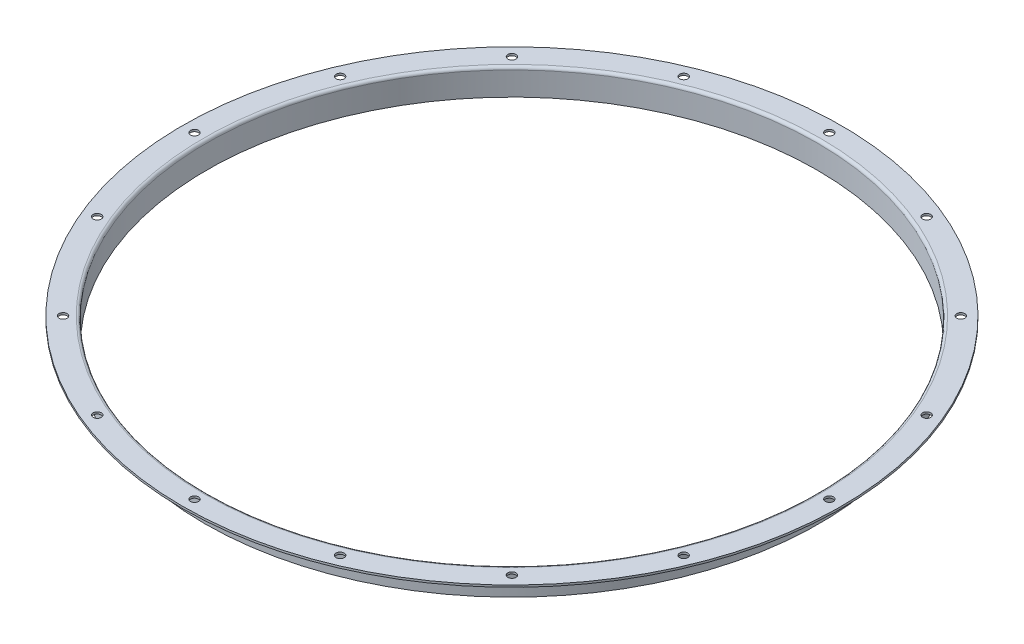
ISO-10303-21;
HEADER;
FILE_DESCRIPTION(('STEP AP214'),'2;1');
FILE_NAME('part.step','',(''),(''),'','','');
FILE_SCHEMA(('AUTOMOTIVE_DESIGN { 1 0 10303 214 1 1 1 1 }'));
ENDSEC;
DATA;
#1=APPLICATION_CONTEXT('core data for automotive mechanical design processes');
#2=APPLICATION_PROTOCOL_DEFINITION('international standard','automotive_design',2000,#1);
#3=PRODUCT_CONTEXT('',#1,'mechanical');
#4=PRODUCT('Part','Part','',(#3));
#5=PRODUCT_RELATED_PRODUCT_CATEGORY('part','',(#4));
#6=PRODUCT_DEFINITION_FORMATION('','',#4);
#7=PRODUCT_DEFINITION_CONTEXT('part definition',#1,'design');
#8=PRODUCT_DEFINITION('design','',#6,#7);
#9=PRODUCT_DEFINITION_SHAPE('','',#8);
#10=(LENGTH_UNIT() NAMED_UNIT(*) SI_UNIT(.MILLI.,.METRE.));
#11=(NAMED_UNIT(*) PLANE_ANGLE_UNIT() SI_UNIT($,.RADIAN.));
#12=(NAMED_UNIT(*) SI_UNIT($,.STERADIAN.) SOLID_ANGLE_UNIT());
#13=UNCERTAINTY_MEASURE_WITH_UNIT(LENGTH_MEASURE(1.E-05),#10,'distance_accuracy_value','');
#14=(GEOMETRIC_REPRESENTATION_CONTEXT(3) GLOBAL_UNCERTAINTY_ASSIGNED_CONTEXT((#13)) GLOBAL_UNIT_ASSIGNED_CONTEXT((#10,
#11,#12)) REPRESENTATION_CONTEXT('',''));
#15=CARTESIAN_POINT('',(0.,0.,0.));
#16=DIRECTION('',(0.,0.,1.));
#17=DIRECTION('',(1.,0.,0.));
#18=AXIS2_PLACEMENT_3D('',#15,#16,#17);
#19=CARTESIAN_POINT('',(0.,-2.5,0.));
#20=DIRECTION('',(0.,1.,0.));
#21=DIRECTION('',(0.,0.,1.));
#22=AXIS2_PLACEMENT_3D('',#19,#20,#21);
#23=PLANE('',#22);
#24=CARTESIAN_POINT('',(-149.820563770931,-2.5,-361.69883697816));
#25=DIRECTION('',(0.,1.,0.));
#26=DIRECTION('',(0.,0.,1.));
#27=AXIS2_PLACEMENT_3D('',#24,#25,#26);
#28=CIRCLE('',#27,5.00000000003186);
#29=CARTESIAN_POINT('',(-149.820563770931,-2.5,-356.698836978128));
#30=VERTEX_POINT('',#29);
#31=EDGE_CURVE('E138',#30,#30,#28,.T.);
#32=ORIENTED_EDGE('',*,*,#31,.T.);
#33=EDGE_LOOP('',(#32));
#34=FACE_BOUND('',#33,.T.);
#35=CARTESIAN_POINT('',(-276.832304834527,-2.5,-276.832304834518));
#36=DIRECTION('',(0.,1.,0.));
#37=DIRECTION('',(0.,0.,1.));
#38=AXIS2_PLACEMENT_3D('',#35,#36,#37);
#39=CIRCLE('',#38,5.00000000003186);
#40=CARTESIAN_POINT('',(-276.832304834527,-2.5,-271.832304834486));
#41=VERTEX_POINT('',#40);
#42=EDGE_CURVE('E304',#41,#41,#39,.T.);
#43=ORIENTED_EDGE('',*,*,#42,.T.);
#44=EDGE_LOOP('',(#43));
#45=FACE_BOUND('',#44,.T.);
#46=CARTESIAN_POINT('',(-361.698836978155,-2.5,-149.820563770912));
#47=DIRECTION('',(0.,1.,0.));
#48=DIRECTION('',(0.,0.,1.));
#49=AXIS2_PLACEMENT_3D('',#46,#47,#48);
#50=CIRCLE('',#49,5.00000000003186);
#51=CARTESIAN_POINT('',(-361.698836978155,-2.5,-144.82056377088));
#52=VERTEX_POINT('',#51);
#53=EDGE_CURVE('E302',#52,#52,#50,.T.);
#54=ORIENTED_EDGE('',*,*,#53,.T.);
#55=EDGE_LOOP('',(#54));
#56=FACE_BOUND('',#55,.T.);
#57=CARTESIAN_POINT('',(-391.499999999978,-2.5,2.22541984840063E-11));
#58=DIRECTION('',(0.,1.,0.));
#59=DIRECTION('',(0.,0.,1.));
#60=AXIS2_PLACEMENT_3D('',#57,#58,#59);
#61=CIRCLE('',#60,5.00000000003186);
#62=CARTESIAN_POINT('',(-391.499999999978,-2.5,5.00000000005411));
#63=VERTEX_POINT('',#62);
#64=EDGE_CURVE('E299',#63,#63,#61,.T.);
#65=ORIENTED_EDGE('',*,*,#64,.T.);
#66=EDGE_LOOP('',(#65));
#67=FACE_BOUND('',#66,.T.);
#68=CARTESIAN_POINT('',(-361.698836978138,-2.5,149.820563770953));
#69=DIRECTION('',(0.,1.,0.));
#70=DIRECTION('',(0.,0.,1.));
#71=AXIS2_PLACEMENT_3D('',#68,#69,#70);
#72=CIRCLE('',#71,5.00000000003186);
#73=CARTESIAN_POINT('',(-361.698836978138,-2.5,154.820563770985));
#74=VERTEX_POINT('',#73);
#75=EDGE_CURVE('E296',#74,#74,#72,.T.);
#76=ORIENTED_EDGE('',*,*,#75,.T.);
#77=EDGE_LOOP('',(#76));
#78=FACE_BOUND('',#77,.T.);
#79=CARTESIAN_POINT('',(-276.832304834495,-2.5,276.832304834549));
#80=DIRECTION('',(0.,1.,0.));
#81=DIRECTION('',(0.,0.,1.));
#82=AXIS2_PLACEMENT_3D('',#79,#80,#81);
#83=CIRCLE('',#82,5.00000000003186);
#84=CARTESIAN_POINT('',(-276.832304834495,-2.5,281.832304834581));
#85=VERTEX_POINT('',#84);
#86=EDGE_CURVE('E293',#85,#85,#83,.T.);
#87=ORIENTED_EDGE('',*,*,#86,.T.);
#88=EDGE_LOOP('',(#87));
#89=FACE_BOUND('',#88,.T.);
#90=CARTESIAN_POINT('',(-149.82056377089,-2.5,361.698836978177));
#91=DIRECTION('',(0.,1.,0.));
#92=DIRECTION('',(0.,0.,1.));
#93=AXIS2_PLACEMENT_3D('',#90,#91,#92);
#94=CIRCLE('',#93,5.00000000003186);
#95=CARTESIAN_POINT('',(-149.82056377089,-2.5,366.698836978209));
#96=VERTEX_POINT('',#95);
#97=EDGE_CURVE('E290',#96,#96,#94,.T.);
#98=ORIENTED_EDGE('',*,*,#97,.T.);
#99=EDGE_LOOP('',(#98));
#100=FACE_BOUND('',#99,.T.);
#101=CARTESIAN_POINT('',(4.45541564282418E-11,-2.5,391.5));
#102=DIRECTION('',(0.,1.,0.));
#103=DIRECTION('',(0.,0.,1.));
#104=AXIS2_PLACEMENT_3D('',#101,#102,#103);
#105=CIRCLE('',#104,5.00000000003188);
#106=CARTESIAN_POINT('',(4.45541564282418E-11,-2.5,396.500000000032));
#107=VERTEX_POINT('',#106);
#108=EDGE_CURVE('E287',#107,#107,#105,.T.);
#109=ORIENTED_EDGE('',*,*,#108,.T.);
#110=EDGE_LOOP('',(#109));
#111=FACE_BOUND('',#110,.T.);
#112=CARTESIAN_POINT('',(149.820563770976,-2.5,361.69883697816));
#113=DIRECTION('',(0.,1.,0.));
#114=DIRECTION('',(0.,0.,1.));
#115=AXIS2_PLACEMENT_3D('',#112,#113,#114);
#116=CIRCLE('',#115,5.00000000003186);
#117=CARTESIAN_POINT('',(149.820563770976,-2.5,366.698836978192));
#118=VERTEX_POINT('',#117);
#119=EDGE_CURVE('E284',#118,#118,#116,.T.);
#120=ORIENTED_EDGE('',*,*,#119,.T.);
#121=EDGE_LOOP('',(#120));
#122=FACE_BOUND('',#121,.T.);
#123=CARTESIAN_POINT('',(276.832304834571,-2.5,276.832304834518));
#124=DIRECTION('',(0.,1.,0.));
#125=DIRECTION('',(0.,0.,1.));
#126=AXIS2_PLACEMENT_3D('',#123,#124,#125);
#127=CIRCLE('',#126,5.00000000003186);
#128=CARTESIAN_POINT('',(276.832304834571,-2.5,281.83230483455));
#129=VERTEX_POINT('',#128);
#130=EDGE_CURVE('E281',#129,#129,#127,.T.);
#131=ORIENTED_EDGE('',*,*,#130,.T.);
#132=EDGE_LOOP('',(#131));
#133=FACE_BOUND('',#132,.T.);
#134=CARTESIAN_POINT('',(361.6988369782,-2.5,149.820563770912));
#135=DIRECTION('',(0.,1.,0.));
#136=DIRECTION('',(0.,0.,1.));
#137=AXIS2_PLACEMENT_3D('',#134,#135,#136);
#138=CIRCLE('',#137,5.00000000003186);
#139=CARTESIAN_POINT('',(361.6988369782,-2.5,154.820563770944));
#140=VERTEX_POINT('',#139);
#141=EDGE_CURVE('E278',#140,#140,#138,.T.);
#142=ORIENTED_EDGE('',*,*,#141,.T.);
#143=EDGE_LOOP('',(#142));
#144=FACE_BOUND('',#143,.T.);
#145=CARTESIAN_POINT('',(391.500000000022,-2.5,-2.22062535618197E-11));
#146=DIRECTION('',(0.,1.,0.));
#147=DIRECTION('',(0.,0.,1.));
#148=AXIS2_PLACEMENT_3D('',#145,#146,#147);
#149=CIRCLE('',#148,5.00000000003186);
#150=CARTESIAN_POINT('',(391.500000000022,-2.5,5.00000000000965));
#151=VERTEX_POINT('',#150);
#152=EDGE_CURVE('E275',#151,#151,#149,.T.);
#153=ORIENTED_EDGE('',*,*,#152,.T.);
#154=EDGE_LOOP('',(#153));
#155=FACE_BOUND('',#154,.T.);
#156=CARTESIAN_POINT('',(361.698836978183,-2.5,-149.820563770953));
#157=DIRECTION('',(0.,1.,0.));
#158=DIRECTION('',(0.,0.,1.));
#159=AXIS2_PLACEMENT_3D('',#156,#157,#158);
#160=CIRCLE('',#159,5.00000000003186);
#161=CARTESIAN_POINT('',(361.698836978183,-2.5,-144.820563770921));
#162=VERTEX_POINT('',#161);
#163=EDGE_CURVE('E266',#162,#162,#160,.T.);
#164=ORIENTED_EDGE('',*,*,#163,.T.);
#165=EDGE_LOOP('',(#164));
#166=FACE_BOUND('',#165,.T.);
#167=CARTESIAN_POINT('',(1.4164930460234E-13,-2.5,-391.5));
#168=DIRECTION('',(0.,1.,0.));
#169=DIRECTION('',(0.,0.,1.));
#170=AXIS2_PLACEMENT_3D('',#167,#168,#169);
#171=CIRCLE('',#170,5.00000000003188);
#172=CARTESIAN_POINT('',(1.4164930460234E-13,-2.5,-386.499999999968));
#173=VERTEX_POINT('',#172);
#174=EDGE_CURVE('E262',#173,#173,#171,.T.);
#175=ORIENTED_EDGE('',*,*,#174,.T.);
#176=EDGE_LOOP('',(#175));
#177=FACE_BOUND('',#176,.T.);
#178=CARTESIAN_POINT('',(276.83230483454,-2.5,-276.832304834549));
#179=DIRECTION('',(0.,1.,0.));
#180=DIRECTION('',(0.,0.,1.));
#181=AXIS2_PLACEMENT_3D('',#178,#179,#180);
#182=CIRCLE('',#181,5.00000000003186);
#183=CARTESIAN_POINT('',(276.83230483454,-2.5,-271.832304834517));
#184=VERTEX_POINT('',#183);
#185=EDGE_CURVE('E260',#184,#184,#182,.T.);
#186=ORIENTED_EDGE('',*,*,#185,.T.);
#187=EDGE_LOOP('',(#186));
#188=FACE_BOUND('',#187,.T.);
#189=CARTESIAN_POINT('',(149.820563770934,-2.5,-361.698836978177));
#190=DIRECTION('',(0.,1.,0.));
#191=DIRECTION('',(0.,0.,1.));
#192=AXIS2_PLACEMENT_3D('',#189,#190,#191);
#193=CIRCLE('',#192,5.00000000003186);
#194=CARTESIAN_POINT('',(149.820563770934,-2.5,-356.698836978145));
#195=VERTEX_POINT('',#194);
#196=EDGE_CURVE('E263',#195,#195,#193,.T.);
#197=ORIENTED_EDGE('',*,*,#196,.T.);
#198=EDGE_LOOP('',(#197));
#199=FACE_BOUND('',#198,.T.);
#200=CARTESIAN_POINT('',(0.,-2.5,0.));
#201=DIRECTION('',(0.,1.,0.));
#202=DIRECTION('',(0.,0.,1.));
#203=AXIS2_PLACEMENT_3D('',#200,#201,#202);
#204=CIRCLE('',#203,406.5);
#205=CARTESIAN_POINT('',(0.,-2.5,406.5));
#206=VERTEX_POINT('',#205);
#207=EDGE_CURVE('E95',#206,#206,#204,.T.);
#208=ORIENTED_EDGE('',*,*,#207,.F.);
#209=EDGE_LOOP('',(#208));
#210=FACE_BOUND('',#209,.T.);
#211=CARTESIAN_POINT('',(0.,-2.5,0.));
#212=DIRECTION('',(0.,1.,0.));
#213=DIRECTION('',(0.,0.,1.));
#214=AXIS2_PLACEMENT_3D('',#211,#212,#213);
#215=CIRCLE('',#214,380.);
#216=CARTESIAN_POINT('',(0.,-2.5,380.));
#217=VERTEX_POINT('',#216);
#218=EDGE_CURVE('E12',#217,#217,#215,.F.);
#219=ORIENTED_EDGE('',*,*,#218,.F.);
#220=EDGE_LOOP('',(#219));
#221=FACE_BOUND('',#220,.T.);
#222=ADVANCED_FACE('F87',(#34,#45,#56,#67,#78,#89,#100,#111,#122,#133,#144,#155,#166,#177,#188,
#199,#210,#221),#23,.F.);
#223=CARTESIAN_POINT('',(0.,0.,0.));
#224=DIRECTION('',(0.,1.,0.));
#225=DIRECTION('',(0.,0.,1.));
#226=AXIS2_PLACEMENT_3D('',#223,#224,#225);
#227=PLANE('',#226);
#228=CARTESIAN_POINT('',(-149.820563770931,0.,-361.69883697816));
#229=DIRECTION('',(0.,1.,0.));
#230=DIRECTION('',(0.,0.,1.));
#231=AXIS2_PLACEMENT_3D('',#228,#229,#230);
#232=CIRCLE('',#231,5.00000000003186);
#233=CARTESIAN_POINT('',(-149.820563770931,0.,-356.698836978128));
#234=VERTEX_POINT('',#233);
#235=EDGE_CURVE('E353',#234,#234,#232,.T.);
#236=ORIENTED_EDGE('',*,*,#235,.F.);
#237=EDGE_LOOP('',(#236));
#238=FACE_BOUND('',#237,.T.);
#239=CARTESIAN_POINT('',(-276.832304834527,0.,-276.832304834518));
#240=DIRECTION('',(0.,1.,0.));
#241=DIRECTION('',(0.,0.,1.));
#242=AXIS2_PLACEMENT_3D('',#239,#240,#241);
#243=CIRCLE('',#242,5.00000000003186);
#244=CARTESIAN_POINT('',(-276.832304834527,0.,-271.832304834486));
#245=VERTEX_POINT('',#244);
#246=EDGE_CURVE('E356',#245,#245,#243,.T.);
#247=ORIENTED_EDGE('',*,*,#246,.F.);
#248=EDGE_LOOP('',(#247));
#249=FACE_BOUND('',#248,.T.);
#250=CARTESIAN_POINT('',(-361.698836978155,0.,-149.820563770912));
#251=DIRECTION('',(0.,1.,0.));
#252=DIRECTION('',(0.,0.,1.));
#253=AXIS2_PLACEMENT_3D('',#250,#251,#252);
#254=CIRCLE('',#253,5.00000000003186);
#255=CARTESIAN_POINT('',(-361.698836978155,0.,-144.82056377088));
#256=VERTEX_POINT('',#255);
#257=EDGE_CURVE('E359',#256,#256,#254,.T.);
#258=ORIENTED_EDGE('',*,*,#257,.F.);
#259=EDGE_LOOP('',(#258));
#260=FACE_BOUND('',#259,.T.);
#261=CARTESIAN_POINT('',(-391.499999999978,0.,2.22541984840063E-11));
#262=DIRECTION('',(0.,1.,0.));
#263=DIRECTION('',(0.,0.,1.));
#264=AXIS2_PLACEMENT_3D('',#261,#262,#263);
#265=CIRCLE('',#264,5.00000000003186);
#266=CARTESIAN_POINT('',(-391.499999999978,0.,5.00000000005411));
#267=VERTEX_POINT('',#266);
#268=EDGE_CURVE('E362',#267,#267,#265,.T.);
#269=ORIENTED_EDGE('',*,*,#268,.F.);
#270=EDGE_LOOP('',(#269));
#271=FACE_BOUND('',#270,.T.);
#272=CARTESIAN_POINT('',(-361.698836978138,0.,149.820563770953));
#273=DIRECTION('',(0.,1.,0.));
#274=DIRECTION('',(0.,0.,1.));
#275=AXIS2_PLACEMENT_3D('',#272,#273,#274);
#276=CIRCLE('',#275,5.00000000003186);
#277=CARTESIAN_POINT('',(-361.698836978138,0.,154.820563770985));
#278=VERTEX_POINT('',#277);
#279=EDGE_CURVE('E365',#278,#278,#276,.T.);
#280=ORIENTED_EDGE('',*,*,#279,.F.);
#281=EDGE_LOOP('',(#280));
#282=FACE_BOUND('',#281,.T.);
#283=CARTESIAN_POINT('',(-276.832304834495,0.,276.832304834549));
#284=DIRECTION('',(0.,1.,0.));
#285=DIRECTION('',(0.,0.,1.));
#286=AXIS2_PLACEMENT_3D('',#283,#284,#285);
#287=CIRCLE('',#286,5.00000000003186);
#288=CARTESIAN_POINT('',(-276.832304834495,0.,281.832304834581));
#289=VERTEX_POINT('',#288);
#290=EDGE_CURVE('E368',#289,#289,#287,.T.);
#291=ORIENTED_EDGE('',*,*,#290,.F.);
#292=EDGE_LOOP('',(#291));
#293=FACE_BOUND('',#292,.T.);
#294=CARTESIAN_POINT('',(-149.82056377089,0.,361.698836978177));
#295=DIRECTION('',(0.,1.,0.));
#296=DIRECTION('',(0.,0.,1.));
#297=AXIS2_PLACEMENT_3D('',#294,#295,#296);
#298=CIRCLE('',#297,5.00000000003186);
#299=CARTESIAN_POINT('',(-149.82056377089,0.,366.698836978209));
#300=VERTEX_POINT('',#299);
#301=EDGE_CURVE('E371',#300,#300,#298,.T.);
#302=ORIENTED_EDGE('',*,*,#301,.F.);
#303=EDGE_LOOP('',(#302));
#304=FACE_BOUND('',#303,.T.);
#305=CARTESIAN_POINT('',(4.45541564282418E-11,0.,391.5));
#306=DIRECTION('',(0.,1.,0.));
#307=DIRECTION('',(0.,0.,1.));
#308=AXIS2_PLACEMENT_3D('',#305,#306,#307);
#309=CIRCLE('',#308,5.00000000003188);
#310=CARTESIAN_POINT('',(4.45541564282418E-11,0.,396.500000000032));
#311=VERTEX_POINT('',#310);
#312=EDGE_CURVE('E374',#311,#311,#309,.T.);
#313=ORIENTED_EDGE('',*,*,#312,.F.);
#314=EDGE_LOOP('',(#313));
#315=FACE_BOUND('',#314,.T.);
#316=CARTESIAN_POINT('',(149.820563770976,0.,361.69883697816));
#317=DIRECTION('',(0.,1.,0.));
#318=DIRECTION('',(0.,0.,1.));
#319=AXIS2_PLACEMENT_3D('',#316,#317,#318);
#320=CIRCLE('',#319,5.00000000003186);
#321=CARTESIAN_POINT('',(149.820563770976,0.,366.698836978192));
#322=VERTEX_POINT('',#321);
#323=EDGE_CURVE('E377',#322,#322,#320,.T.);
#324=ORIENTED_EDGE('',*,*,#323,.F.);
#325=EDGE_LOOP('',(#324));
#326=FACE_BOUND('',#325,.T.);
#327=CARTESIAN_POINT('',(276.832304834571,0.,276.832304834518));
#328=DIRECTION('',(0.,1.,0.));
#329=DIRECTION('',(0.,0.,1.));
#330=AXIS2_PLACEMENT_3D('',#327,#328,#329);
#331=CIRCLE('',#330,5.00000000003186);
#332=CARTESIAN_POINT('',(276.832304834571,0.,281.83230483455));
#333=VERTEX_POINT('',#332);
#334=EDGE_CURVE('E380',#333,#333,#331,.T.);
#335=ORIENTED_EDGE('',*,*,#334,.F.);
#336=EDGE_LOOP('',(#335));
#337=FACE_BOUND('',#336,.T.);
#338=CARTESIAN_POINT('',(361.6988369782,0.,149.820563770912));
#339=DIRECTION('',(0.,1.,0.));
#340=DIRECTION('',(0.,0.,1.));
#341=AXIS2_PLACEMENT_3D('',#338,#339,#340);
#342=CIRCLE('',#341,5.00000000003186);
#343=CARTESIAN_POINT('',(361.6988369782,0.,154.820563770944));
#344=VERTEX_POINT('',#343);
#345=EDGE_CURVE('E383',#344,#344,#342,.T.);
#346=ORIENTED_EDGE('',*,*,#345,.F.);
#347=EDGE_LOOP('',(#346));
#348=FACE_BOUND('',#347,.T.);
#349=CARTESIAN_POINT('',(391.500000000022,0.,-2.22062535618197E-11));
#350=DIRECTION('',(0.,1.,0.));
#351=DIRECTION('',(0.,0.,1.));
#352=AXIS2_PLACEMENT_3D('',#349,#350,#351);
#353=CIRCLE('',#352,5.00000000003186);
#354=CARTESIAN_POINT('',(391.500000000022,0.,5.00000000000965));
#355=VERTEX_POINT('',#354);
#356=EDGE_CURVE('E386',#355,#355,#353,.T.);
#357=ORIENTED_EDGE('',*,*,#356,.F.);
#358=EDGE_LOOP('',(#357));
#359=FACE_BOUND('',#358,.T.);
#360=CARTESIAN_POINT('',(361.698836978183,0.,-149.820563770953));
#361=DIRECTION('',(0.,1.,0.));
#362=DIRECTION('',(0.,0.,1.));
#363=AXIS2_PLACEMENT_3D('',#360,#361,#362);
#364=CIRCLE('',#363,5.00000000003186);
#365=CARTESIAN_POINT('',(361.698836978183,0.,-144.820563770921));
#366=VERTEX_POINT('',#365);
#367=EDGE_CURVE('E389',#366,#366,#364,.T.);
#368=ORIENTED_EDGE('',*,*,#367,.F.);
#369=EDGE_LOOP('',(#368));
#370=FACE_BOUND('',#369,.T.);
#371=CARTESIAN_POINT('',(1.4164930460234E-13,0.,-391.5));
#372=DIRECTION('',(0.,1.,0.));
#373=DIRECTION('',(0.,0.,1.));
#374=AXIS2_PLACEMENT_3D('',#371,#372,#373);
#375=CIRCLE('',#374,5.00000000003188);
#376=CARTESIAN_POINT('',(1.4164930460234E-13,0.,-386.499999999968));
#377=VERTEX_POINT('',#376);
#378=EDGE_CURVE('E392',#377,#377,#375,.T.);
#379=ORIENTED_EDGE('',*,*,#378,.F.);
#380=EDGE_LOOP('',(#379));
#381=FACE_BOUND('',#380,.T.);
#382=CARTESIAN_POINT('',(276.83230483454,0.,-276.832304834549));
#383=DIRECTION('',(0.,1.,0.));
#384=DIRECTION('',(0.,0.,1.));
#385=AXIS2_PLACEMENT_3D('',#382,#383,#384);
#386=CIRCLE('',#385,5.00000000003186);
#387=CARTESIAN_POINT('',(276.83230483454,0.,-271.832304834517));
#388=VERTEX_POINT('',#387);
#389=EDGE_CURVE('E257',#388,#388,#386,.T.);
#390=ORIENTED_EDGE('',*,*,#389,.F.);
#391=EDGE_LOOP('',(#390));
#392=FACE_BOUND('',#391,.T.);
#393=CARTESIAN_POINT('',(149.820563770934,0.,-361.698836978177));
#394=DIRECTION('',(0.,1.,0.));
#395=DIRECTION('',(0.,0.,1.));
#396=AXIS2_PLACEMENT_3D('',#393,#394,#395);
#397=CIRCLE('',#396,5.00000000003186);
#398=CARTESIAN_POINT('',(149.820563770934,0.,-356.698836978145));
#399=VERTEX_POINT('',#398);
#400=EDGE_CURVE('E269',#399,#399,#397,.T.);
#401=ORIENTED_EDGE('',*,*,#400,.F.);
#402=EDGE_LOOP('',(#401));
#403=FACE_BOUND('',#402,.T.);
#404=CARTESIAN_POINT('',(0.,0.,0.));
#405=DIRECTION('',(0.,1.,0.));
#406=DIRECTION('',(0.,0.,1.));
#407=AXIS2_PLACEMENT_3D('',#404,#405,#406);
#408=CIRCLE('',#407,406.5);
#409=CARTESIAN_POINT('',(0.,0.,406.5));
#410=VERTEX_POINT('',#409);
#411=EDGE_CURVE('E151',#410,#410,#408,.T.);
#412=ORIENTED_EDGE('',*,*,#411,.T.);
#413=EDGE_LOOP('',(#412));
#414=FACE_BOUND('',#413,.T.);
#415=CARTESIAN_POINT('',(0.,0.,0.));
#416=DIRECTION('',(0.,1.,0.));
#417=DIRECTION('',(0.,0.,1.));
#418=AXIS2_PLACEMENT_3D('',#415,#416,#417);
#419=CIRCLE('',#418,380.);
#420=CARTESIAN_POINT('',(0.,0.,380.));
#421=VERTEX_POINT('',#420);
#422=EDGE_CURVE('E102',#421,#421,#419,.T.);
#423=ORIENTED_EDGE('',*,*,#422,.F.);
#424=EDGE_LOOP('',(#423));
#425=FACE_BOUND('',#424,.T.);
#426=ADVANCED_FACE('F156',(#238,#249,#260,#271,#282,#293,#304,#315,#326,#337,#348,#359,#370,
#381,#392,#403,#414,#425),#227,.T.);
#427=CARTESIAN_POINT('',(0.,-2.5,0.));
#428=DIRECTION('',(0.,1.,0.));
#429=DIRECTION('',(0.,0.,1.));
#430=AXIS2_PLACEMENT_3D('',#427,#428,#429);
#431=CYLINDRICAL_SURFACE('',#430,406.5);
#432=ORIENTED_EDGE('',*,*,#207,.T.);
#433=EDGE_LOOP('',(#432));
#434=FACE_BOUND('',#433,.T.);
#435=ORIENTED_EDGE('',*,*,#411,.F.);
#436=EDGE_LOOP('',(#435));
#437=FACE_BOUND('',#436,.T.);
#438=ADVANCED_FACE('F89',(#434,#437),#431,.T.);
#439=CARTESIAN_POINT('',(0.,-32.5,0.));
#440=DIRECTION('',(0.,-1.,0.));
#441=DIRECTION('',(0.,0.,-1.));
#442=AXIS2_PLACEMENT_3D('',#439,#440,#441);
#443=PLANE('',#442);
#444=CARTESIAN_POINT('',(0.,-32.5,0.));
#445=DIRECTION('',(0.,1.,0.));
#446=DIRECTION('',(0.,0.,1.));
#447=AXIS2_PLACEMENT_3D('',#444,#445,#446);
#448=CIRCLE('',#447,376.5);
#449=CARTESIAN_POINT('',(0.,-32.5,376.5));
#450=VERTEX_POINT('',#449);
#451=EDGE_CURVE('E130',#450,#450,#448,.T.);
#452=ORIENTED_EDGE('',*,*,#451,.T.);
#453=EDGE_LOOP('',(#452));
#454=FACE_BOUND('',#453,.T.);
#455=CARTESIAN_POINT('',(0.,-32.5,0.));
#456=DIRECTION('',(0.,1.,0.));
#457=DIRECTION('',(0.,0.,1.));
#458=AXIS2_PLACEMENT_3D('',#455,#456,#457);
#459=CIRCLE('',#458,379.);
#460=CARTESIAN_POINT('',(0.,-32.5,379.));
#461=VERTEX_POINT('',#460);
#462=EDGE_CURVE('E140',#461,#461,#459,.T.);
#463=ORIENTED_EDGE('',*,*,#462,.F.);
#464=EDGE_LOOP('',(#463));
#465=FACE_BOUND('',#464,.T.);
#466=ADVANCED_FACE('F160',(#454,#465),#443,.T.);
#467=CARTESIAN_POINT('',(0.,-2.5,0.));
#468=DIRECTION('',(0.,1.,0.));
#469=DIRECTION('',(0.,0.,1.));
#470=AXIS2_PLACEMENT_3D('',#467,#468,#469);
#471=CYLINDRICAL_SURFACE('',#470,379.);
#472=DIRECTION('',(0.,-1.,0.));
#473=VECTOR('',#472,1.);
#474=CARTESIAN_POINT('',(0.,-2.5,379.));
#475=LINE('',#474,#473);
#476=CARTESIAN_POINT('',(0.,-3.5,379.));
#477=VERTEX_POINT('',#476);
#478=EDGE_CURVE('E129',#477,#461,#475,.T.);
#479=ORIENTED_EDGE('',*,*,#478,.F.);
#480=CARTESIAN_POINT('',(0.,-3.5,0.));
#481=DIRECTION('',(0.,1.,0.));
#482=DIRECTION('',(0.,0.,1.));
#483=AXIS2_PLACEMENT_3D('',#480,#481,#482);
#484=CIRCLE('',#483,379.);
#485=EDGE_CURVE('E128',#477,#477,#484,.T.);
#486=ORIENTED_EDGE('',*,*,#485,.F.);
#487=ORIENTED_EDGE('',*,*,#478,.T.);
#488=ORIENTED_EDGE('',*,*,#462,.T.);
#489=EDGE_LOOP('',(#479,#486,#487,#488));
#490=FACE_BOUND('',#489,.T.);
#491=ADVANCED_FACE('F166',(#490),#471,.T.);
#492=CARTESIAN_POINT('',(0.,-3.5,0.));
#493=DIRECTION('',(0.,1.,0.));
#494=DIRECTION('',(0.,0.,1.));
#495=AXIS2_PLACEMENT_3D('',#492,#493,#494);
#496=TOROIDAL_SURFACE('',#495,380.,1.);
#497=CARTESIAN_POINT('',(0.,-3.5,380.));
#498=DIRECTION('',(1.,0.,0.));
#499=DIRECTION('',(0.,1.,0.));
#500=AXIS2_PLACEMENT_3D('',#497,#498,#499);
#501=CIRCLE('',#500,1.);
#502=EDGE_CURVE('E126',#217,#477,#501,.F.);
#503=ORIENTED_EDGE('',*,*,#502,.F.);
#504=ORIENTED_EDGE('',*,*,#218,.T.);
#505=ORIENTED_EDGE('',*,*,#502,.T.);
#506=ORIENTED_EDGE('',*,*,#485,.T.);
#507=EDGE_LOOP('',(#503,#504,#505,#506));
#508=FACE_BOUND('',#507,.T.);
#509=ADVANCED_FACE('F125',(#508),#496,.F.);
#510=CARTESIAN_POINT('',(0.,-2.5,0.));
#511=DIRECTION('',(0.,1.,0.));
#512=DIRECTION('',(0.,0.,1.));
#513=AXIS2_PLACEMENT_3D('',#510,#511,#512);
#514=CYLINDRICAL_SURFACE('',#513,376.5);
#515=DIRECTION('',(0.,1.,0.));
#516=VECTOR('',#515,1.);
#517=CARTESIAN_POINT('',(0.,-2.5,376.5));
#518=LINE('',#517,#516);
#519=CARTESIAN_POINT('',(0.,-3.50000000000001,376.5));
#520=VERTEX_POINT('',#519);
#521=EDGE_CURVE('E143',#520,#450,#518,.F.);
#522=ORIENTED_EDGE('',*,*,#521,.T.);
#523=ORIENTED_EDGE('',*,*,#451,.F.);
#524=ORIENTED_EDGE('',*,*,#521,.F.);
#525=CARTESIAN_POINT('',(0.,-3.50000000000001,0.));
#526=DIRECTION('',(0.,1.,0.));
#527=DIRECTION('',(0.,0.,1.));
#528=AXIS2_PLACEMENT_3D('',#525,#526,#527);
#529=CIRCLE('',#528,376.5);
#530=EDGE_CURVE('E134',#520,#520,#529,.T.);
#531=ORIENTED_EDGE('',*,*,#530,.T.);
#532=EDGE_LOOP('',(#522,#523,#524,#531));
#533=FACE_BOUND('',#532,.T.);
#534=ADVANCED_FACE('F181',(#533),#514,.F.);
#535=CARTESIAN_POINT('',(0.,-3.5,0.));
#536=DIRECTION('',(0.,1.,0.));
#537=DIRECTION('',(0.,0.,1.));
#538=AXIS2_PLACEMENT_3D('',#535,#536,#537);
#539=TOROIDAL_SURFACE('',#538,380.,3.5);
#540=CARTESIAN_POINT('',(0.,-3.5,380.));
#541=DIRECTION('',(-1.,0.,0.));
#542=DIRECTION('',(0.,0.,1.));
#543=AXIS2_PLACEMENT_3D('',#540,#541,#542);
#544=CIRCLE('',#543,3.5);
#545=EDGE_CURVE('E145',#421,#520,#544,.T.);
#546=ORIENTED_EDGE('',*,*,#545,.T.);
#547=ORIENTED_EDGE('',*,*,#530,.F.);
#548=ORIENTED_EDGE('',*,*,#545,.F.);
#549=ORIENTED_EDGE('',*,*,#422,.T.);
#550=EDGE_LOOP('',(#546,#547,#548,#549));
#551=FACE_BOUND('',#550,.T.);
#552=ADVANCED_FACE('F177',(#551),#539,.T.);
#553=CARTESIAN_POINT('',(149.820563770934,-10.,-361.698836978177));
#554=DIRECTION('',(0.,1.,0.));
#555=DIRECTION('',(0.,0.,1.));
#556=AXIS2_PLACEMENT_3D('',#553,#554,#555);
#557=CYLINDRICAL_SURFACE('',#556,5.00000000003186);
#558=ORIENTED_EDGE('',*,*,#400,.T.);
#559=EDGE_LOOP('',(#558));
#560=FACE_BOUND('',#559,.T.);
#561=ORIENTED_EDGE('',*,*,#196,.F.);
#562=EDGE_LOOP('',(#561));
#563=FACE_BOUND('',#562,.T.);
#564=ADVANCED_FACE('F180',(#560,#563),#557,.F.);
#565=CARTESIAN_POINT('',(276.83230483454,-10.,-276.832304834549));
#566=DIRECTION('',(0.,1.,0.));
#567=DIRECTION('',(0.,0.,1.));
#568=AXIS2_PLACEMENT_3D('',#565,#566,#567);
#569=CYLINDRICAL_SURFACE('',#568,5.00000000003186);
#570=ORIENTED_EDGE('',*,*,#389,.T.);
#571=EDGE_LOOP('',(#570));
#572=FACE_BOUND('',#571,.T.);
#573=ORIENTED_EDGE('',*,*,#185,.F.);
#574=EDGE_LOOP('',(#573));
#575=FACE_BOUND('',#574,.T.);
#576=ADVANCED_FACE('F192',(#572,#575),#569,.F.);
#577=CARTESIAN_POINT('',(1.4164930460234E-13,-10.,-391.5));
#578=DIRECTION('',(0.,1.,0.));
#579=DIRECTION('',(0.,0.,1.));
#580=AXIS2_PLACEMENT_3D('',#577,#578,#579);
#581=CYLINDRICAL_SURFACE('',#580,5.00000000003188);
#582=ORIENTED_EDGE('',*,*,#378,.T.);
#583=EDGE_LOOP('',(#582));
#584=FACE_BOUND('',#583,.T.);
#585=ORIENTED_EDGE('',*,*,#174,.F.);
#586=EDGE_LOOP('',(#585));
#587=FACE_BOUND('',#586,.T.);
#588=ADVANCED_FACE('F245',(#584,#587),#581,.F.);
#589=CARTESIAN_POINT('',(361.698836978183,-10.,-149.820563770953));
#590=DIRECTION('',(0.,1.,0.));
#591=DIRECTION('',(0.,0.,1.));
#592=AXIS2_PLACEMENT_3D('',#589,#590,#591);
#593=CYLINDRICAL_SURFACE('',#592,5.00000000003186);
#594=ORIENTED_EDGE('',*,*,#367,.T.);
#595=EDGE_LOOP('',(#594));
#596=FACE_BOUND('',#595,.T.);
#597=ORIENTED_EDGE('',*,*,#163,.F.);
#598=EDGE_LOOP('',(#597));
#599=FACE_BOUND('',#598,.T.);
#600=ADVANCED_FACE('F241',(#596,#599),#593,.F.);
#601=CARTESIAN_POINT('',(391.500000000022,-10.,-2.22062535618197E-11));
#602=DIRECTION('',(0.,1.,0.));
#603=DIRECTION('',(0.,0.,1.));
#604=AXIS2_PLACEMENT_3D('',#601,#602,#603);
#605=CYLINDRICAL_SURFACE('',#604,5.00000000003186);
#606=ORIENTED_EDGE('',*,*,#356,.T.);
#607=EDGE_LOOP('',(#606));
#608=FACE_BOUND('',#607,.T.);
#609=ORIENTED_EDGE('',*,*,#152,.F.);
#610=EDGE_LOOP('',(#609));
#611=FACE_BOUND('',#610,.T.);
#612=ADVANCED_FACE('F237',(#608,#611),#605,.F.);
#613=CARTESIAN_POINT('',(361.6988369782,-10.,149.820563770912));
#614=DIRECTION('',(0.,1.,0.));
#615=DIRECTION('',(0.,0.,1.));
#616=AXIS2_PLACEMENT_3D('',#613,#614,#615);
#617=CYLINDRICAL_SURFACE('',#616,5.00000000003186);
#618=ORIENTED_EDGE('',*,*,#345,.T.);
#619=EDGE_LOOP('',(#618));
#620=FACE_BOUND('',#619,.T.);
#621=ORIENTED_EDGE('',*,*,#141,.F.);
#622=EDGE_LOOP('',(#621));
#623=FACE_BOUND('',#622,.T.);
#624=ADVANCED_FACE('F233',(#620,#623),#617,.F.);
#625=CARTESIAN_POINT('',(276.832304834571,-10.,276.832304834518));
#626=DIRECTION('',(0.,1.,0.));
#627=DIRECTION('',(0.,0.,1.));
#628=AXIS2_PLACEMENT_3D('',#625,#626,#627);
#629=CYLINDRICAL_SURFACE('',#628,5.00000000003186);
#630=ORIENTED_EDGE('',*,*,#334,.T.);
#631=EDGE_LOOP('',(#630));
#632=FACE_BOUND('',#631,.T.);
#633=ORIENTED_EDGE('',*,*,#130,.F.);
#634=EDGE_LOOP('',(#633));
#635=FACE_BOUND('',#634,.T.);
#636=ADVANCED_FACE('F229',(#632,#635),#629,.F.);
#637=CARTESIAN_POINT('',(149.820563770976,-10.,361.69883697816));
#638=DIRECTION('',(0.,1.,0.));
#639=DIRECTION('',(0.,0.,1.));
#640=AXIS2_PLACEMENT_3D('',#637,#638,#639);
#641=CYLINDRICAL_SURFACE('',#640,5.00000000003186);
#642=ORIENTED_EDGE('',*,*,#323,.T.);
#643=EDGE_LOOP('',(#642));
#644=FACE_BOUND('',#643,.T.);
#645=ORIENTED_EDGE('',*,*,#119,.F.);
#646=EDGE_LOOP('',(#645));
#647=FACE_BOUND('',#646,.T.);
#648=ADVANCED_FACE('F225',(#644,#647),#641,.F.);
#649=CARTESIAN_POINT('',(4.45541564282418E-11,-10.,391.5));
#650=DIRECTION('',(0.,1.,0.));
#651=DIRECTION('',(0.,0.,1.));
#652=AXIS2_PLACEMENT_3D('',#649,#650,#651);
#653=CYLINDRICAL_SURFACE('',#652,5.00000000003188);
#654=ORIENTED_EDGE('',*,*,#312,.T.);
#655=EDGE_LOOP('',(#654));
#656=FACE_BOUND('',#655,.T.);
#657=ORIENTED_EDGE('',*,*,#108,.F.);
#658=EDGE_LOOP('',(#657));
#659=FACE_BOUND('',#658,.T.);
#660=ADVANCED_FACE('F221',(#656,#659),#653,.F.);
#661=CARTESIAN_POINT('',(-149.82056377089,-10.,361.698836978177));
#662=DIRECTION('',(0.,1.,0.));
#663=DIRECTION('',(0.,0.,1.));
#664=AXIS2_PLACEMENT_3D('',#661,#662,#663);
#665=CYLINDRICAL_SURFACE('',#664,5.00000000003186);
#666=ORIENTED_EDGE('',*,*,#301,.T.);
#667=EDGE_LOOP('',(#666));
#668=FACE_BOUND('',#667,.T.);
#669=ORIENTED_EDGE('',*,*,#97,.F.);
#670=EDGE_LOOP('',(#669));
#671=FACE_BOUND('',#670,.T.);
#672=ADVANCED_FACE('F217',(#668,#671),#665,.F.);
#673=CARTESIAN_POINT('',(-276.832304834495,-10.,276.832304834549));
#674=DIRECTION('',(0.,1.,0.));
#675=DIRECTION('',(0.,0.,1.));
#676=AXIS2_PLACEMENT_3D('',#673,#674,#675);
#677=CYLINDRICAL_SURFACE('',#676,5.00000000003186);
#678=ORIENTED_EDGE('',*,*,#290,.T.);
#679=EDGE_LOOP('',(#678));
#680=FACE_BOUND('',#679,.T.);
#681=ORIENTED_EDGE('',*,*,#86,.F.);
#682=EDGE_LOOP('',(#681));
#683=FACE_BOUND('',#682,.T.);
#684=ADVANCED_FACE('F213',(#680,#683),#677,.F.);
#685=CARTESIAN_POINT('',(-361.698836978138,-10.,149.820563770953));
#686=DIRECTION('',(0.,1.,0.));
#687=DIRECTION('',(0.,0.,1.));
#688=AXIS2_PLACEMENT_3D('',#685,#686,#687);
#689=CYLINDRICAL_SURFACE('',#688,5.00000000003186);
#690=ORIENTED_EDGE('',*,*,#279,.T.);
#691=EDGE_LOOP('',(#690));
#692=FACE_BOUND('',#691,.T.);
#693=ORIENTED_EDGE('',*,*,#75,.F.);
#694=EDGE_LOOP('',(#693));
#695=FACE_BOUND('',#694,.T.);
#696=ADVANCED_FACE('F209',(#692,#695),#689,.F.);
#697=CARTESIAN_POINT('',(-391.499999999978,-10.,2.22541984840063E-11));
#698=DIRECTION('',(0.,1.,0.));
#699=DIRECTION('',(0.,0.,1.));
#700=AXIS2_PLACEMENT_3D('',#697,#698,#699);
#701=CYLINDRICAL_SURFACE('',#700,5.00000000003186);
#702=ORIENTED_EDGE('',*,*,#268,.T.);
#703=EDGE_LOOP('',(#702));
#704=FACE_BOUND('',#703,.T.);
#705=ORIENTED_EDGE('',*,*,#64,.F.);
#706=EDGE_LOOP('',(#705));
#707=FACE_BOUND('',#706,.T.);
#708=ADVANCED_FACE('F205',(#704,#707),#701,.F.);
#709=CARTESIAN_POINT('',(-361.698836978155,-10.,-149.820563770912));
#710=DIRECTION('',(0.,1.,0.));
#711=DIRECTION('',(0.,0.,1.));
#712=AXIS2_PLACEMENT_3D('',#709,#710,#711);
#713=CYLINDRICAL_SURFACE('',#712,5.00000000003186);
#714=ORIENTED_EDGE('',*,*,#257,.T.);
#715=EDGE_LOOP('',(#714));
#716=FACE_BOUND('',#715,.T.);
#717=ORIENTED_EDGE('',*,*,#53,.F.);
#718=EDGE_LOOP('',(#717));
#719=FACE_BOUND('',#718,.T.);
#720=ADVANCED_FACE('F201',(#716,#719),#713,.F.);
#721=CARTESIAN_POINT('',(-276.832304834527,-10.,-276.832304834518));
#722=DIRECTION('',(0.,1.,0.));
#723=DIRECTION('',(0.,0.,1.));
#724=AXIS2_PLACEMENT_3D('',#721,#722,#723);
#725=CYLINDRICAL_SURFACE('',#724,5.00000000003186);
#726=ORIENTED_EDGE('',*,*,#246,.T.);
#727=EDGE_LOOP('',(#726));
#728=FACE_BOUND('',#727,.T.);
#729=ORIENTED_EDGE('',*,*,#42,.F.);
#730=EDGE_LOOP('',(#729));
#731=FACE_BOUND('',#730,.T.);
#732=ADVANCED_FACE('F197',(#728,#731),#725,.F.);
#733=CARTESIAN_POINT('',(-149.820563770931,-10.,-361.69883697816));
#734=DIRECTION('',(0.,1.,0.));
#735=DIRECTION('',(0.,0.,1.));
#736=AXIS2_PLACEMENT_3D('',#733,#734,#735);
#737=CYLINDRICAL_SURFACE('',#736,5.00000000003186);
#738=ORIENTED_EDGE('',*,*,#235,.T.);
#739=EDGE_LOOP('',(#738));
#740=FACE_BOUND('',#739,.T.);
#741=ORIENTED_EDGE('',*,*,#31,.F.);
#742=EDGE_LOOP('',(#741));
#743=FACE_BOUND('',#742,.T.);
#744=ADVANCED_FACE('F194',(#740,#743),#737,.F.);
#745=CLOSED_SHELL('',(#222,#426,#438,#466,#491,#509,#534,#552,#564,#576,#588,#600,#612,#624,
#636,#648,#660,#672,#684,#696,#708,#720,#732,#744));
#746=MANIFOLD_SOLID_BREP('B2',#745);
#747=ADVANCED_BREP_SHAPE_REPRESENTATION('',(#18,#746),#14);
#748=SHAPE_DEFINITION_REPRESENTATION(#9,#747);
ENDSEC;
END-ISO-10303-21;
